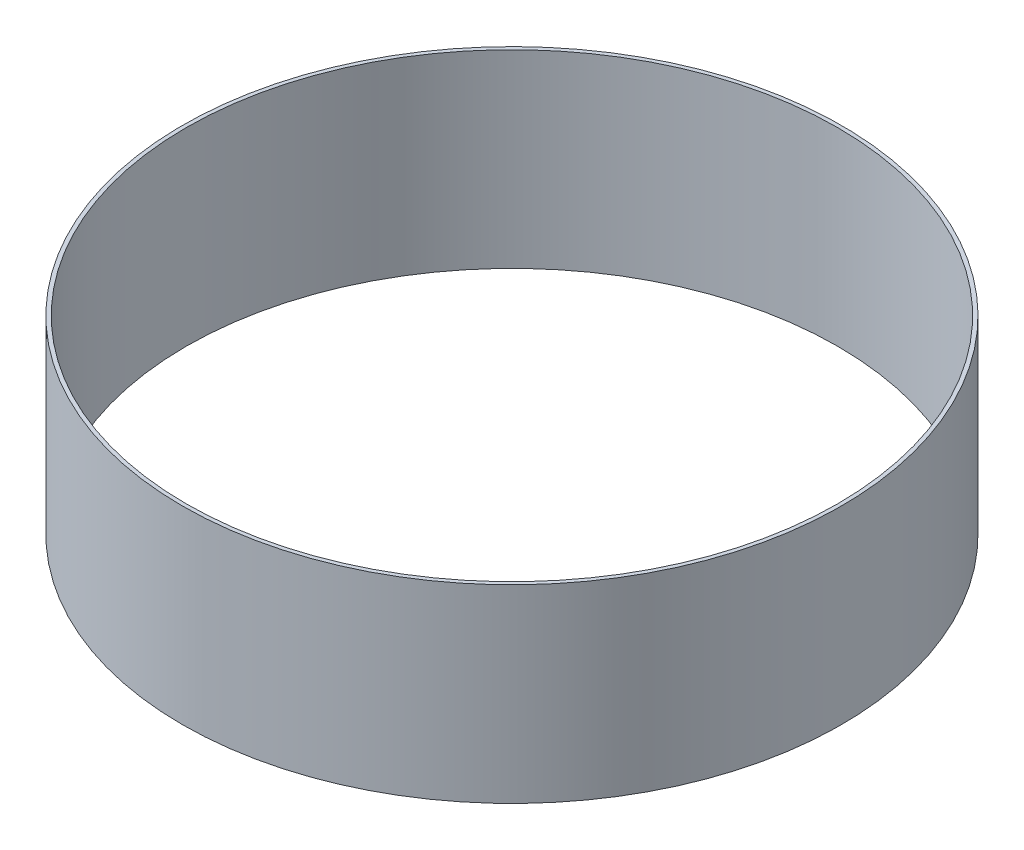
ISO-10303-21;
HEADER;
FILE_DESCRIPTION(('STEP AP214'),'2;1');
FILE_NAME('part.step','',(''),(''),'','','');
FILE_SCHEMA(('AUTOMOTIVE_DESIGN { 1 0 10303 214 1 1 1 1 }'));
ENDSEC;
DATA;
#1=APPLICATION_CONTEXT('core data for automotive mechanical design processes');
#2=APPLICATION_PROTOCOL_DEFINITION('international standard','automotive_design',2000,#1);
#3=PRODUCT_CONTEXT('',#1,'mechanical');
#4=PRODUCT('Part','Part','',(#3));
#5=PRODUCT_RELATED_PRODUCT_CATEGORY('part','',(#4));
#6=PRODUCT_DEFINITION_FORMATION('','',#4);
#7=PRODUCT_DEFINITION_CONTEXT('part definition',#1,'design');
#8=PRODUCT_DEFINITION('design','',#6,#7);
#9=PRODUCT_DEFINITION_SHAPE('','',#8);
#10=(LENGTH_UNIT() NAMED_UNIT(*) SI_UNIT(.MILLI.,.METRE.));
#11=(NAMED_UNIT(*) PLANE_ANGLE_UNIT() SI_UNIT($,.RADIAN.));
#12=(NAMED_UNIT(*) SI_UNIT($,.STERADIAN.) SOLID_ANGLE_UNIT());
#13=UNCERTAINTY_MEASURE_WITH_UNIT(LENGTH_MEASURE(1.E-05),#10,'distance_accuracy_value','');
#14=(GEOMETRIC_REPRESENTATION_CONTEXT(3) GLOBAL_UNCERTAINTY_ASSIGNED_CONTEXT((#13)) GLOBAL_UNIT_ASSIGNED_CONTEXT((#10,
#11,#12)) REPRESENTATION_CONTEXT('',''));
#15=CARTESIAN_POINT('',(0.,0.,0.));
#16=DIRECTION('',(0.,0.,1.));
#17=DIRECTION('',(1.,0.,0.));
#18=AXIS2_PLACEMENT_3D('',#15,#16,#17);
#19=CARTESIAN_POINT('',(131.064,76.2,0.));
#20=DIRECTION('',(0.,1.,0.));
#21=DIRECTION('',(0.,0.,1.));
#22=AXIS2_PLACEMENT_3D('',#19,#20,#21);
#23=PLANE('',#22);
#24=CARTESIAN_POINT('',(0.,76.2,0.));
#25=DIRECTION('',(0.,1.,0.));
#26=DIRECTION('',(0.,0.,1.));
#27=AXIS2_PLACEMENT_3D('',#24,#25,#26);
#28=CIRCLE('',#27,132.588);
#29=CARTESIAN_POINT('',(0.,76.2,132.588));
#30=VERTEX_POINT('',#29);
#31=EDGE_CURVE('E10',#30,#30,#28,.T.);
#32=ORIENTED_EDGE('',*,*,#31,.T.);
#33=EDGE_LOOP('',(#32));
#34=FACE_BOUND('',#33,.T.);
#35=CARTESIAN_POINT('',(0.,76.2,0.));
#36=DIRECTION('',(0.,1.,0.));
#37=DIRECTION('',(0.,0.,1.));
#38=AXIS2_PLACEMENT_3D('',#35,#36,#37);
#39=CIRCLE('',#38,131.064);
#40=CARTESIAN_POINT('',(0.,76.2,131.064));
#41=VERTEX_POINT('',#40);
#42=EDGE_CURVE('E54',#41,#41,#39,.T.);
#43=ORIENTED_EDGE('',*,*,#42,.F.);
#44=EDGE_LOOP('',(#43));
#45=FACE_BOUND('',#44,.T.);
#46=ADVANCED_FACE('F37',(#34,#45),#23,.T.);
#47=CARTESIAN_POINT('',(0.,91.7467664516127,0.));
#48=DIRECTION('',(0.,1.,0.));
#49=DIRECTION('',(0.,0.,1.));
#50=AXIS2_PLACEMENT_3D('',#47,#48,#49);
#51=CYLINDRICAL_SURFACE('',#50,132.588);
#52=CARTESIAN_POINT('',(0.,0.,0.));
#53=DIRECTION('',(0.,1.,0.));
#54=DIRECTION('',(0.,0.,1.));
#55=AXIS2_PLACEMENT_3D('',#52,#53,#54);
#56=CIRCLE('',#55,132.588);
#57=CARTESIAN_POINT('',(0.,0.,132.588));
#58=VERTEX_POINT('',#57);
#59=EDGE_CURVE('E44',#58,#58,#56,.T.);
#60=ORIENTED_EDGE('',*,*,#59,.T.);
#61=EDGE_LOOP('',(#60));
#62=FACE_BOUND('',#61,.T.);
#63=ORIENTED_EDGE('',*,*,#31,.F.);
#64=EDGE_LOOP('',(#63));
#65=FACE_BOUND('',#64,.T.);
#66=ADVANCED_FACE('F64',(#62,#65),#51,.T.);
#67=CARTESIAN_POINT('',(131.064,0.,0.));
#68=DIRECTION('',(0.,1.,0.));
#69=DIRECTION('',(0.,0.,1.));
#70=AXIS2_PLACEMENT_3D('',#67,#68,#69);
#71=PLANE('',#70);
#72=ORIENTED_EDGE('',*,*,#59,.F.);
#73=EDGE_LOOP('',(#72));
#74=FACE_BOUND('',#73,.T.);
#75=CARTESIAN_POINT('',(0.,0.,0.));
#76=DIRECTION('',(0.,1.,0.));
#77=DIRECTION('',(0.,0.,1.));
#78=AXIS2_PLACEMENT_3D('',#75,#76,#77);
#79=CIRCLE('',#78,131.064);
#80=CARTESIAN_POINT('',(0.,0.,131.064));
#81=VERTEX_POINT('',#80);
#82=EDGE_CURVE('E49',#81,#81,#79,.T.);
#83=ORIENTED_EDGE('',*,*,#82,.T.);
#84=EDGE_LOOP('',(#83));
#85=FACE_BOUND('',#84,.T.);
#86=ADVANCED_FACE('F68',(#74,#85),#71,.F.);
#87=CARTESIAN_POINT('',(0.,91.7467664516127,0.));
#88=DIRECTION('',(0.,1.,0.));
#89=DIRECTION('',(0.,0.,1.));
#90=AXIS2_PLACEMENT_3D('',#87,#88,#89);
#91=CYLINDRICAL_SURFACE('',#90,131.064);
#92=ORIENTED_EDGE('',*,*,#82,.F.);
#93=EDGE_LOOP('',(#92));
#94=FACE_BOUND('',#93,.T.);
#95=ORIENTED_EDGE('',*,*,#42,.T.);
#96=EDGE_LOOP('',(#95));
#97=FACE_BOUND('',#96,.T.);
#98=ADVANCED_FACE('F61',(#94,#97),#91,.F.);
#99=CLOSED_SHELL('',(#46,#66,#86,#98));
#100=MANIFOLD_SOLID_BREP('B2',#99);
#101=ADVANCED_BREP_SHAPE_REPRESENTATION('',(#18,#100),#14);
#102=SHAPE_DEFINITION_REPRESENTATION(#9,#101);
ENDSEC;
END-ISO-10303-21;
